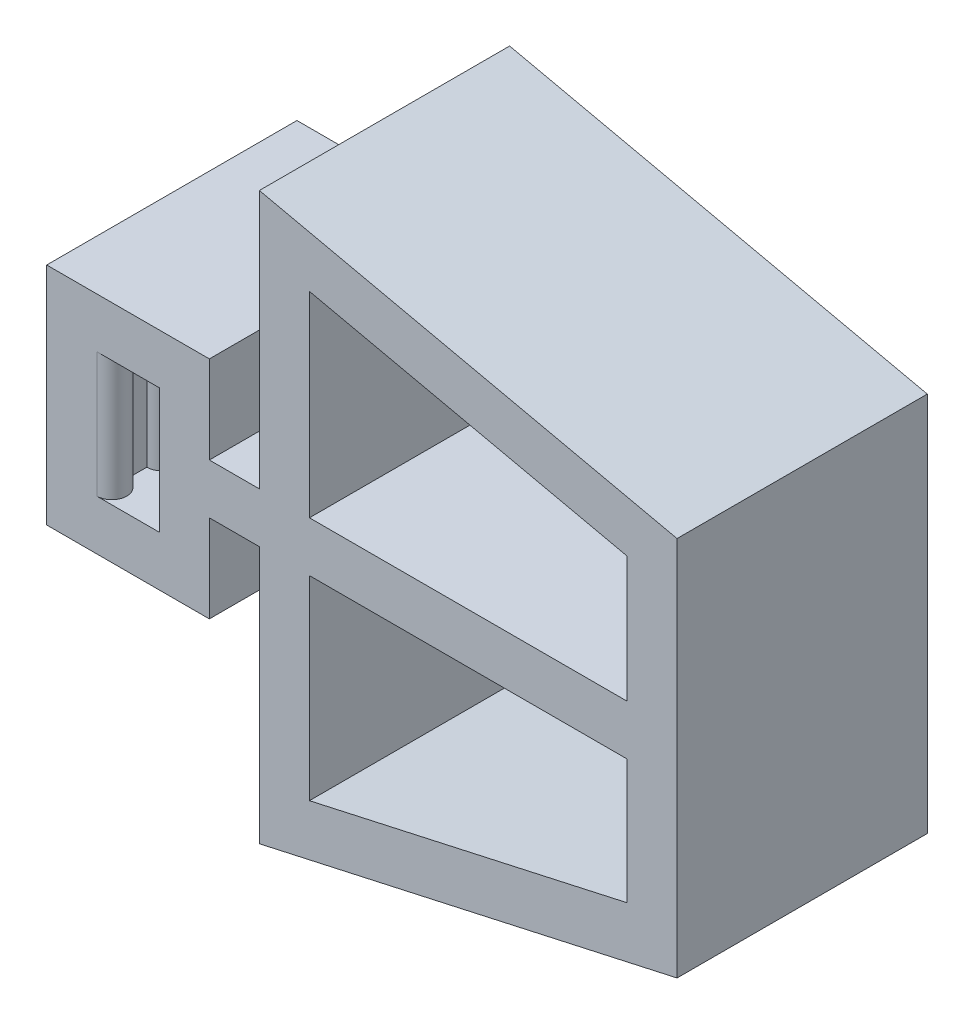
ISO-10303-21;
HEADER;
FILE_DESCRIPTION(('STEP AP214'),'2;1');
FILE_NAME('part.step','',(''),(''),'','','');
FILE_SCHEMA(('AUTOMOTIVE_DESIGN { 1 0 10303 214 1 1 1 1 }'));
ENDSEC;
DATA;
#1=APPLICATION_CONTEXT('core data for automotive mechanical design processes');
#2=APPLICATION_PROTOCOL_DEFINITION('international standard','automotive_design',2000,#1);
#3=PRODUCT_CONTEXT('',#1,'mechanical');
#4=PRODUCT('Part','Part','',(#3));
#5=PRODUCT_RELATED_PRODUCT_CATEGORY('part','',(#4));
#6=PRODUCT_DEFINITION_FORMATION('','',#4);
#7=PRODUCT_DEFINITION_CONTEXT('part definition',#1,'design');
#8=PRODUCT_DEFINITION('design','',#6,#7);
#9=PRODUCT_DEFINITION_SHAPE('','',#8);
#10=(LENGTH_UNIT() NAMED_UNIT(*) SI_UNIT(.MILLI.,.METRE.));
#11=(NAMED_UNIT(*) PLANE_ANGLE_UNIT() SI_UNIT($,.RADIAN.));
#12=(NAMED_UNIT(*) SI_UNIT($,.STERADIAN.) SOLID_ANGLE_UNIT());
#13=UNCERTAINTY_MEASURE_WITH_UNIT(LENGTH_MEASURE(1.E-05),#10,'distance_accuracy_value','');
#14=(GEOMETRIC_REPRESENTATION_CONTEXT(3) GLOBAL_UNCERTAINTY_ASSIGNED_CONTEXT((#13)) GLOBAL_UNIT_ASSIGNED_CONTEXT((#10,
#11,#12)) REPRESENTATION_CONTEXT('',''));
#15=CARTESIAN_POINT('',(0.,0.,0.));
#16=DIRECTION('',(0.,0.,1.));
#17=DIRECTION('',(1.,0.,0.));
#18=AXIS2_PLACEMENT_3D('',#15,#16,#17);
#19=CARTESIAN_POINT('',(0.,-38.3564883880665,10.));
#20=DIRECTION('',(0.,1.,0.));
#21=DIRECTION('',(0.,0.,1.));
#22=AXIS2_PLACEMENT_3D('',#19,#20,#21);
#23=PLANE('',#22);
#24=CARTESIAN_POINT('',(43.3058128637581,-38.3564883880665,1.4));
#25=DIRECTION('',(0.,-1.,0.));
#26=DIRECTION('',(0.,0.,1.));
#27=AXIS2_PLACEMENT_3D('',#24,#25,#26);
#28=CIRCLE('',#27,0.6);
#29=CARTESIAN_POINT('',(43.3058128637581,-38.3564883880665,0.8));
#30=VERTEX_POINT('',#29);
#31=CARTESIAN_POINT('',(43.3058128637581,-38.3564883880665,2.));
#32=VERTEX_POINT('',#31);
#33=EDGE_CURVE('E52',#30,#32,#28,.T.);
#34=ORIENTED_EDGE('',*,*,#33,.F.);
#35=DIRECTION('',(0.,0.,-1.));
#36=VECTOR('',#35,1.);
#37=CARTESIAN_POINT('',(43.3058128637581,-38.3564883880665,10.));
#38=LINE('',#37,#36);
#39=CARTESIAN_POINT('',(43.3058128637581,-38.3564883880665,0.));
#40=VERTEX_POINT('',#39);
#41=EDGE_CURVE('E322',#30,#40,#38,.T.);
#42=ORIENTED_EDGE('',*,*,#41,.T.);
#43=DIRECTION('',(1.,0.,0.));
#44=VECTOR('',#43,1.);
#45=CARTESIAN_POINT('',(0.,-38.3564883880665,0.));
#46=LINE('',#45,#44);
#47=CARTESIAN_POINT('',(45.8058128637581,-38.3564883880665,0.));
#48=VERTEX_POINT('',#47);
#49=EDGE_CURVE('E386',#40,#48,#46,.T.);
#50=ORIENTED_EDGE('',*,*,#49,.T.);
#51=DIRECTION('',(0.,0.,-1.));
#52=VECTOR('',#51,1.);
#53=CARTESIAN_POINT('',(45.8058128637581,-38.3564883880665,10.));
#54=LINE('',#53,#52);
#55=CARTESIAN_POINT('',(45.8058128637581,-38.3564883880665,10.));
#56=VERTEX_POINT('',#55);
#57=EDGE_CURVE('E282',#56,#48,#54,.T.);
#58=ORIENTED_EDGE('',*,*,#57,.F.);
#59=DIRECTION('',(1.,0.,0.));
#60=VECTOR('',#59,1.);
#61=CARTESIAN_POINT('',(0.,-38.3564883880665,10.));
#62=LINE('',#61,#60);
#63=CARTESIAN_POINT('',(43.3058128637581,-38.3564883880665,10.));
#64=VERTEX_POINT('',#63);
#65=EDGE_CURVE('E446',#64,#56,#62,.T.);
#66=ORIENTED_EDGE('',*,*,#65,.F.);
#67=CARTESIAN_POINT('',(43.3058128637581,-38.3564883880665,9.4));
#68=DIRECTION('',(0.,-1.,0.));
#69=DIRECTION('',(0.,0.,1.));
#70=AXIS2_PLACEMENT_3D('',#67,#68,#69);
#71=CIRCLE('',#70,0.6);
#72=CARTESIAN_POINT('',(43.3058128637581,-38.3564883880665,8.8));
#73=VERTEX_POINT('',#72);
#74=EDGE_CURVE('E596',#73,#64,#71,.T.);
#75=ORIENTED_EDGE('',*,*,#74,.F.);
#76=CARTESIAN_POINT('',(43.3058128637581,-38.3564883880665,8.));
#77=VERTEX_POINT('',#76);
#78=EDGE_CURVE('E275',#73,#77,#38,.T.);
#79=ORIENTED_EDGE('',*,*,#78,.T.);
#80=CARTESIAN_POINT('',(43.3058128637581,-38.3564883880665,7.4));
#81=DIRECTION('',(0.,-1.,0.));
#82=DIRECTION('',(0.,0.,1.));
#83=AXIS2_PLACEMENT_3D('',#80,#81,#82);
#84=CIRCLE('',#83,0.6);
#85=CARTESIAN_POINT('',(43.3058128637581,-38.3564883880665,6.8));
#86=VERTEX_POINT('',#85);
#87=EDGE_CURVE('E603',#86,#77,#84,.T.);
#88=ORIENTED_EDGE('',*,*,#87,.F.);
#89=CARTESIAN_POINT('',(43.3058128637581,-38.3564883880665,6.));
#90=VERTEX_POINT('',#89);
#91=EDGE_CURVE('E627',#86,#90,#38,.T.);
#92=ORIENTED_EDGE('',*,*,#91,.T.);
#93=CARTESIAN_POINT('',(43.3058128637581,-38.3564883880665,5.4));
#94=DIRECTION('',(0.,-1.,0.));
#95=DIRECTION('',(0.,0.,1.));
#96=AXIS2_PLACEMENT_3D('',#93,#94,#95);
#97=CIRCLE('',#96,0.6);
#98=CARTESIAN_POINT('',(43.3058128637581,-38.3564883880665,4.8));
#99=VERTEX_POINT('',#98);
#100=EDGE_CURVE('E612',#99,#90,#97,.T.);
#101=ORIENTED_EDGE('',*,*,#100,.F.);
#102=CARTESIAN_POINT('',(43.3058128637581,-38.3564883880665,4.));
#103=VERTEX_POINT('',#102);
#104=EDGE_CURVE('E626',#99,#103,#38,.T.);
#105=ORIENTED_EDGE('',*,*,#104,.T.);
#106=CARTESIAN_POINT('',(43.3058128637581,-38.3564883880665,3.4));
#107=DIRECTION('',(0.,-1.,0.));
#108=DIRECTION('',(0.,0.,1.));
#109=AXIS2_PLACEMENT_3D('',#106,#107,#108);
#110=CIRCLE('',#109,0.6);
#111=CARTESIAN_POINT('',(43.3058128637581,-38.3564883880665,2.8));
#112=VERTEX_POINT('',#111);
#113=EDGE_CURVE('E60',#112,#103,#110,.T.);
#114=ORIENTED_EDGE('',*,*,#113,.F.);
#115=EDGE_CURVE('E624',#112,#32,#38,.T.);
#116=ORIENTED_EDGE('',*,*,#115,.T.);
#117=EDGE_LOOP('',(#34,#42,#50,#58,#66,#75,#79,#88,#92,#101,#105,#114,#116));
#118=FACE_BOUND('',#117,.T.);
#119=ADVANCED_FACE('F35',(#118),#23,.F.);
#120=CARTESIAN_POINT('',(0.,-43.3564883880665,10.));
#121=DIRECTION('',(0.,1.,0.));
#122=DIRECTION('',(0.,0.,1.));
#123=AXIS2_PLACEMENT_3D('',#120,#121,#122);
#124=PLANE('',#123);
#125=DIRECTION('',(0.,0.,-1.));
#126=VECTOR('',#125,1.);
#127=CARTESIAN_POINT('',(43.3058128637581,-43.3564883880665,10.));
#128=LINE('',#127,#126);
#129=CARTESIAN_POINT('',(43.3058128637581,-43.3564883880665,0.8));
#130=VERTEX_POINT('',#129);
#131=CARTESIAN_POINT('',(43.3058128637581,-43.3564883880665,0.));
#132=VERTEX_POINT('',#131);
#133=EDGE_CURVE('E266',#130,#132,#128,.T.);
#134=ORIENTED_EDGE('',*,*,#133,.F.);
#135=CARTESIAN_POINT('',(43.3058128637581,-43.3564883880665,1.4));
#136=DIRECTION('',(0.,-1.,0.));
#137=DIRECTION('',(0.,0.,1.));
#138=AXIS2_PLACEMENT_3D('',#135,#136,#137);
#139=CIRCLE('',#138,0.6);
#140=CARTESIAN_POINT('',(43.3058128637581,-43.3564883880665,2.));
#141=VERTEX_POINT('',#140);
#142=EDGE_CURVE('E251',#130,#141,#139,.T.);
#143=ORIENTED_EDGE('',*,*,#142,.T.);
#144=CARTESIAN_POINT('',(43.3058128637581,-43.3564883880665,2.8));
#145=VERTEX_POINT('',#144);
#146=EDGE_CURVE('E264',#145,#141,#128,.T.);
#147=ORIENTED_EDGE('',*,*,#146,.F.);
#148=CARTESIAN_POINT('',(43.3058128637581,-43.3564883880665,3.4));
#149=DIRECTION('',(0.,-1.,0.));
#150=DIRECTION('',(0.,0.,1.));
#151=AXIS2_PLACEMENT_3D('',#148,#149,#150);
#152=CIRCLE('',#151,0.6);
#153=CARTESIAN_POINT('',(43.3058128637581,-43.3564883880665,4.));
#154=VERTEX_POINT('',#153);
#155=EDGE_CURVE('E619',#145,#154,#152,.T.);
#156=ORIENTED_EDGE('',*,*,#155,.T.);
#157=CARTESIAN_POINT('',(43.3058128637581,-43.3564883880665,4.8));
#158=VERTEX_POINT('',#157);
#159=EDGE_CURVE('E271',#158,#154,#128,.T.);
#160=ORIENTED_EDGE('',*,*,#159,.F.);
#161=CARTESIAN_POINT('',(43.3058128637581,-43.3564883880665,5.4));
#162=DIRECTION('',(0.,-1.,0.));
#163=DIRECTION('',(0.,0.,1.));
#164=AXIS2_PLACEMENT_3D('',#161,#162,#163);
#165=CIRCLE('',#164,0.6);
#166=CARTESIAN_POINT('',(43.3058128637581,-43.3564883880665,6.));
#167=VERTEX_POINT('',#166);
#168=EDGE_CURVE('E611',#158,#167,#165,.T.);
#169=ORIENTED_EDGE('',*,*,#168,.T.);
#170=CARTESIAN_POINT('',(43.3058128637581,-43.3564883880665,6.8));
#171=VERTEX_POINT('',#170);
#172=EDGE_CURVE('E274',#171,#167,#128,.T.);
#173=ORIENTED_EDGE('',*,*,#172,.F.);
#174=CARTESIAN_POINT('',(43.3058128637581,-43.3564883880665,7.4));
#175=DIRECTION('',(0.,-1.,0.));
#176=DIRECTION('',(0.,0.,1.));
#177=AXIS2_PLACEMENT_3D('',#174,#175,#176);
#178=CIRCLE('',#177,0.6);
#179=CARTESIAN_POINT('',(43.3058128637581,-43.3564883880665,8.));
#180=VERTEX_POINT('',#179);
#181=EDGE_CURVE('E592',#171,#180,#178,.T.);
#182=ORIENTED_EDGE('',*,*,#181,.T.);
#183=CARTESIAN_POINT('',(43.3058128637581,-43.3564883880665,8.8));
#184=VERTEX_POINT('',#183);
#185=EDGE_CURVE('E276',#184,#180,#128,.T.);
#186=ORIENTED_EDGE('',*,*,#185,.F.);
#187=CARTESIAN_POINT('',(43.3058128637581,-43.3564883880665,9.4));
#188=DIRECTION('',(0.,-1.,0.));
#189=DIRECTION('',(0.,0.,1.));
#190=AXIS2_PLACEMENT_3D('',#187,#188,#189);
#191=CIRCLE('',#190,0.6);
#192=CARTESIAN_POINT('',(43.3058128637581,-43.3564883880665,10.));
#193=VERTEX_POINT('',#192);
#194=EDGE_CURVE('E590',#184,#193,#191,.T.);
#195=ORIENTED_EDGE('',*,*,#194,.T.);
#196=DIRECTION('',(1.,0.,0.));
#197=VECTOR('',#196,1.);
#198=CARTESIAN_POINT('',(0.,-43.3564883880665,10.));
#199=LINE('',#198,#197);
#200=CARTESIAN_POINT('',(45.8058128637581,-43.3564883880665,10.));
#201=VERTEX_POINT('',#200);
#202=EDGE_CURVE('E439',#193,#201,#199,.T.);
#203=ORIENTED_EDGE('',*,*,#202,.T.);
#204=DIRECTION('',(0.,0.,-1.));
#205=VECTOR('',#204,1.);
#206=CARTESIAN_POINT('',(45.8058128637581,-43.3564883880665,10.));
#207=LINE('',#206,#205);
#208=CARTESIAN_POINT('',(45.8058128637581,-43.3564883880665,0.));
#209=VERTEX_POINT('',#208);
#210=EDGE_CURVE('E280',#201,#209,#207,.T.);
#211=ORIENTED_EDGE('',*,*,#210,.T.);
#212=DIRECTION('',(1.,0.,0.));
#213=VECTOR('',#212,1.);
#214=CARTESIAN_POINT('',(0.,-43.3564883880665,0.));
#215=LINE('',#214,#213);
#216=EDGE_CURVE('E392',#132,#209,#215,.T.);
#217=ORIENTED_EDGE('',*,*,#216,.F.);
#218=EDGE_LOOP('',(#134,#143,#147,#156,#160,#169,#173,#182,#186,#195,#203,#211,#217));
#219=FACE_BOUND('',#218,.T.);
#220=ADVANCED_FACE('F262',(#219),#124,.T.);
#221=CARTESIAN_POINT('',(43.3058128637581,0.,10.));
#222=DIRECTION('',(1.,0.,0.));
#223=DIRECTION('',(0.,0.,-1.));
#224=AXIS2_PLACEMENT_3D('',#221,#222,#223);
#225=PLANE('',#224);
#226=ORIENTED_EDGE('',*,*,#41,.F.);
#227=DIRECTION('',(0.,1.,0.));
#228=VECTOR('',#227,1.);
#229=CARTESIAN_POINT('',(43.3058128637581,-43.3564883880665,0.8));
#230=LINE('',#229,#228);
#231=EDGE_CURVE('E257',#130,#30,#230,.T.);
#232=ORIENTED_EDGE('',*,*,#231,.F.);
#233=ORIENTED_EDGE('',*,*,#133,.T.);
#234=DIRECTION('',(0.,-1.,0.));
#235=VECTOR('',#234,1.);
#236=CARTESIAN_POINT('',(43.3058128637581,0.,0.));
#237=LINE('',#236,#235);
#238=EDGE_CURVE('E395',#40,#132,#237,.T.);
#239=ORIENTED_EDGE('',*,*,#238,.F.);
#240=EDGE_LOOP('',(#226,#232,#233,#239));
#241=FACE_BOUND('',#240,.T.);
#242=ADVANCED_FACE('F501',(#241),#225,.T.);
#243=ORIENTED_EDGE('',*,*,#146,.T.);
#244=DIRECTION('',(0.,1.,0.));
#245=VECTOR('',#244,1.);
#246=CARTESIAN_POINT('',(43.3058128637581,-43.3564883880665,2.));
#247=LINE('',#246,#245);
#248=EDGE_CURVE('E248',#141,#32,#247,.T.);
#249=ORIENTED_EDGE('',*,*,#248,.T.);
#250=ORIENTED_EDGE('',*,*,#115,.F.);
#251=DIRECTION('',(0.,1.,0.));
#252=VECTOR('',#251,1.);
#253=CARTESIAN_POINT('',(43.3058128637581,-43.3564883880665,2.8));
#254=LINE('',#253,#252);
#255=EDGE_CURVE('E270',#145,#112,#254,.T.);
#256=ORIENTED_EDGE('',*,*,#255,.F.);
#257=EDGE_LOOP('',(#243,#249,#250,#256));
#258=FACE_BOUND('',#257,.T.);
#259=ADVANCED_FACE('F269',(#258),#225,.T.);
#260=ORIENTED_EDGE('',*,*,#159,.T.);
#261=DIRECTION('',(0.,1.,0.));
#262=VECTOR('',#261,1.);
#263=CARTESIAN_POINT('',(43.3058128637581,-43.3564883880665,4.));
#264=LINE('',#263,#262);
#265=EDGE_CURVE('E614',#154,#103,#264,.T.);
#266=ORIENTED_EDGE('',*,*,#265,.T.);
#267=ORIENTED_EDGE('',*,*,#104,.F.);
#268=DIRECTION('',(0.,1.,0.));
#269=VECTOR('',#268,1.);
#270=CARTESIAN_POINT('',(43.3058128637581,-43.3564883880665,4.8));
#271=LINE('',#270,#269);
#272=EDGE_CURVE('E609',#158,#99,#271,.T.);
#273=ORIENTED_EDGE('',*,*,#272,.F.);
#274=EDGE_LOOP('',(#260,#266,#267,#273));
#275=FACE_BOUND('',#274,.T.);
#276=ADVANCED_FACE('F572',(#275),#225,.T.);
#277=ORIENTED_EDGE('',*,*,#172,.T.);
#278=DIRECTION('',(0.,1.,0.));
#279=VECTOR('',#278,1.);
#280=CARTESIAN_POINT('',(43.3058128637581,-43.3564883880665,6.));
#281=LINE('',#280,#279);
#282=EDGE_CURVE('E605',#167,#90,#281,.T.);
#283=ORIENTED_EDGE('',*,*,#282,.T.);
#284=ORIENTED_EDGE('',*,*,#91,.F.);
#285=DIRECTION('',(0.,1.,0.));
#286=VECTOR('',#285,1.);
#287=CARTESIAN_POINT('',(43.3058128637581,-43.3564883880665,6.8));
#288=LINE('',#287,#286);
#289=EDGE_CURVE('E601',#171,#86,#288,.T.);
#290=ORIENTED_EDGE('',*,*,#289,.F.);
#291=EDGE_LOOP('',(#277,#283,#284,#290));
#292=FACE_BOUND('',#291,.T.);
#293=ADVANCED_FACE('F575',(#292),#225,.T.);
#294=ORIENTED_EDGE('',*,*,#185,.T.);
#295=DIRECTION('',(0.,1.,0.));
#296=VECTOR('',#295,1.);
#297=CARTESIAN_POINT('',(43.3058128637581,-43.3564883880665,8.));
#298=LINE('',#297,#296);
#299=EDGE_CURVE('E584',#180,#77,#298,.T.);
#300=ORIENTED_EDGE('',*,*,#299,.T.);
#301=ORIENTED_EDGE('',*,*,#78,.F.);
#302=DIRECTION('',(0.,1.,0.));
#303=VECTOR('',#302,1.);
#304=CARTESIAN_POINT('',(43.3058128637581,-43.3564883880665,8.8));
#305=LINE('',#304,#303);
#306=EDGE_CURVE('E349',#184,#73,#305,.T.);
#307=ORIENTED_EDGE('',*,*,#306,.F.);
#308=EDGE_LOOP('',(#294,#300,#301,#307));
#309=FACE_BOUND('',#308,.T.);
#310=ADVANCED_FACE('F566',(#309),#225,.T.);
#311=CARTESIAN_POINT('',(0.,-41.8564883880665,10.));
#312=DIRECTION('',(0.,-1.,0.));
#313=DIRECTION('',(1.,0.,0.));
#314=AXIS2_PLACEMENT_3D('',#311,#312,#313);
#315=PLANE('',#314);
#316=DIRECTION('',(-1.,0.,0.));
#317=VECTOR('',#316,1.);
#318=CARTESIAN_POINT('',(0.,-41.8564883880665,0.));
#319=LINE('',#318,#317);
#320=CARTESIAN_POINT('',(64.4976609563172,-41.8564883880665,0.));
#321=VERTEX_POINT('',#320);
#322=CARTESIAN_POINT('',(51.8058128637581,-41.8564883880665,0.));
#323=VERTEX_POINT('',#322);
#324=EDGE_CURVE('E398',#321,#323,#319,.T.);
#325=ORIENTED_EDGE('',*,*,#324,.F.);
#326=DIRECTION('',(0.,0.,-1.));
#327=VECTOR('',#326,1.);
#328=CARTESIAN_POINT('',(64.4976609563172,-41.8564883880665,10.));
#329=LINE('',#328,#327);
#330=CARTESIAN_POINT('',(64.4976609563172,-41.8564883880665,10.));
#331=VERTEX_POINT('',#330);
#332=EDGE_CURVE('E11',#331,#321,#329,.T.);
#333=ORIENTED_EDGE('',*,*,#332,.F.);
#334=DIRECTION('',(-1.,0.,0.));
#335=VECTOR('',#334,1.);
#336=CARTESIAN_POINT('',(0.,-41.8564883880665,10.));
#337=LINE('',#336,#335);
#338=CARTESIAN_POINT('',(51.8058128637581,-41.8564883880665,10.));
#339=VERTEX_POINT('',#338);
#340=EDGE_CURVE('E431',#331,#339,#337,.T.);
#341=ORIENTED_EDGE('',*,*,#340,.T.);
#342=DIRECTION('',(0.,0.,-1.));
#343=VECTOR('',#342,1.);
#344=CARTESIAN_POINT('',(51.8058128637581,-41.8564883880665,10.));
#345=LINE('',#344,#343);
#346=EDGE_CURVE('E285',#339,#323,#345,.T.);
#347=ORIENTED_EDGE('',*,*,#346,.T.);
#348=EDGE_LOOP('',(#325,#333,#341,#347));
#349=FACE_BOUND('',#348,.T.);
#350=ADVANCED_FACE('F563',(#349),#315,.T.);
#351=CARTESIAN_POINT('',(64.4976609563172,0.,10.));
#352=DIRECTION('',(-1.,0.,0.));
#353=DIRECTION('',(0.,0.,1.));
#354=AXIS2_PLACEMENT_3D('',#351,#352,#353);
#355=PLANE('',#354);
#356=DIRECTION('',(0.,1.,0.));
#357=VECTOR('',#356,1.);
#358=CARTESIAN_POINT('',(64.4976609563172,0.,0.));
#359=LINE('',#358,#357);
#360=CARTESIAN_POINT('',(64.4976609563172,-46.8330535692618,0.));
#361=VERTEX_POINT('',#360);
#362=EDGE_CURVE('E351',#361,#321,#359,.T.);
#363=ORIENTED_EDGE('',*,*,#362,.F.);
#364=DIRECTION('',(0.,0.,-1.));
#365=VECTOR('',#364,1.);
#366=CARTESIAN_POINT('',(64.4976609563172,-46.8330535692618,10.));
#367=LINE('',#366,#365);
#368=CARTESIAN_POINT('',(64.4976609563172,-46.8330535692618,10.));
#369=VERTEX_POINT('',#368);
#370=EDGE_CURVE('E44',#369,#361,#367,.T.);
#371=ORIENTED_EDGE('',*,*,#370,.F.);
#372=DIRECTION('',(0.,1.,0.));
#373=VECTOR('',#372,1.);
#374=CARTESIAN_POINT('',(64.4976609563172,0.,10.));
#375=LINE('',#374,#373);
#376=EDGE_CURVE('E426',#369,#331,#375,.T.);
#377=ORIENTED_EDGE('',*,*,#376,.T.);
#378=ORIENTED_EDGE('',*,*,#332,.T.);
#379=EDGE_LOOP('',(#363,#371,#377,#378));
#380=FACE_BOUND('',#379,.T.);
#381=ADVANCED_FACE('F419',(#380),#355,.T.);
#382=CARTESIAN_POINT('',(12.9177161387051,-58.2680520347448,10.));
#383=DIRECTION('',(-0.216439613938121,0.976296007119929,0.));
#384=DIRECTION('',(-0.976296007119929,-0.216439613938121,0.));
#385=AXIS2_PLACEMENT_3D('',#382,#383,#384);
#386=PLANE('',#385);
#387=DIRECTION('',(0.976296007119929,0.216439613938121,0.));
#388=VECTOR('',#387,1.);
#389=CARTESIAN_POINT('',(12.9177161387051,-58.2680520347448,0.));
#390=LINE('',#389,#388);
#391=CARTESIAN_POINT('',(51.8058128637581,-49.6467685504574,0.));
#392=VERTEX_POINT('',#391);
#393=EDGE_CURVE('E401',#392,#361,#390,.T.);
#394=ORIENTED_EDGE('',*,*,#393,.F.);
#395=DIRECTION('',(0.,0.,-1.));
#396=VECTOR('',#395,1.);
#397=CARTESIAN_POINT('',(51.8058128637581,-49.6467685504574,10.));
#398=LINE('',#397,#396);
#399=CARTESIAN_POINT('',(51.8058128637581,-49.6467685504574,10.));
#400=VERTEX_POINT('',#399);
#401=EDGE_CURVE('E405',#400,#392,#398,.T.);
#402=ORIENTED_EDGE('',*,*,#401,.F.);
#403=DIRECTION('',(0.976296007119929,0.216439613938121,0.));
#404=VECTOR('',#403,1.);
#405=CARTESIAN_POINT('',(12.9177161387051,-58.2680520347448,10.));
#406=LINE('',#405,#404);
#407=EDGE_CURVE('E414',#400,#369,#406,.T.);
#408=ORIENTED_EDGE('',*,*,#407,.T.);
#409=ORIENTED_EDGE('',*,*,#370,.T.);
#410=EDGE_LOOP('',(#394,#402,#408,#409));
#411=FACE_BOUND('',#410,.T.);
#412=ADVANCED_FACE('F411',(#411),#386,.T.);
#413=CARTESIAN_POINT('',(45.8058128637581,0.,10.));
#414=DIRECTION('',(1.,0.,0.));
#415=DIRECTION('',(0.,0.,-1.));
#416=AXIS2_PLACEMENT_3D('',#413,#414,#415);
#417=PLANE('',#416);
#418=DIRECTION('',(0.,-1.,0.));
#419=VECTOR('',#418,1.);
#420=CARTESIAN_POINT('',(45.8058128637581,0.,0.));
#421=LINE('',#420,#419);
#422=EDGE_CURVE('E389',#48,#209,#421,.T.);
#423=ORIENTED_EDGE('',*,*,#422,.T.);
#424=ORIENTED_EDGE('',*,*,#210,.F.);
#425=DIRECTION('',(0.,-1.,0.));
#426=VECTOR('',#425,1.);
#427=CARTESIAN_POINT('',(45.8058128637581,0.,10.));
#428=LINE('',#427,#426);
#429=EDGE_CURVE('E444',#56,#201,#428,.T.);
#430=ORIENTED_EDGE('',*,*,#429,.F.);
#431=ORIENTED_EDGE('',*,*,#57,.T.);
#432=EDGE_LOOP('',(#423,#424,#430,#431));
#433=FACE_BOUND('',#432,.T.);
#434=ADVANCED_FACE('F505',(#433),#417,.F.);
#435=CARTESIAN_POINT('',(47.805812863758,0.,10.));
#436=DIRECTION('',(-1.,0.,0.));
#437=DIRECTION('',(0.,0.,1.));
#438=AXIS2_PLACEMENT_3D('',#435,#436,#437);
#439=PLANE('',#438);
#440=DIRECTION('',(0.,1.,0.));
#441=VECTOR('',#440,1.);
#442=CARTESIAN_POINT('',(47.805812863758,0.,0.));
#443=LINE('',#442,#441);
#444=CARTESIAN_POINT('',(47.805812863758,-45.3564883880665,0.));
#445=VERTEX_POINT('',#444);
#446=CARTESIAN_POINT('',(47.805812863758,-41.8564883880665,0.));
#447=VERTEX_POINT('',#446);
#448=EDGE_CURVE('E362',#445,#447,#443,.T.);
#449=ORIENTED_EDGE('',*,*,#448,.T.);
#450=DIRECTION('',(0.,0.,-1.));
#451=VECTOR('',#450,1.);
#452=CARTESIAN_POINT('',(47.805812863758,-41.8564883880665,10.));
#453=LINE('',#452,#451);
#454=CARTESIAN_POINT('',(47.805812863758,-41.8564883880665,10.));
#455=VERTEX_POINT('',#454);
#456=EDGE_CURVE('E319',#455,#447,#453,.T.);
#457=ORIENTED_EDGE('',*,*,#456,.F.);
#458=DIRECTION('',(0.,1.,0.));
#459=VECTOR('',#458,1.);
#460=CARTESIAN_POINT('',(47.805812863758,0.,10.));
#461=LINE('',#460,#459);
#462=CARTESIAN_POINT('',(47.805812863758,-45.3564883880665,10.));
#463=VERTEX_POINT('',#462);
#464=EDGE_CURVE('E470',#463,#455,#461,.T.);
#465=ORIENTED_EDGE('',*,*,#464,.F.);
#466=DIRECTION('',(0.,0.,-1.));
#467=VECTOR('',#466,1.);
#468=CARTESIAN_POINT('',(47.805812863758,-45.3564883880665,10.));
#469=LINE('',#468,#467);
#470=EDGE_CURVE('E286',#463,#445,#469,.T.);
#471=ORIENTED_EDGE('',*,*,#470,.T.);
#472=EDGE_LOOP('',(#449,#457,#465,#471));
#473=FACE_BOUND('',#472,.T.);
#474=ADVANCED_FACE('F546',(#473),#439,.F.);
#475=CARTESIAN_POINT('',(0.,-41.8564883880665,10.));
#476=DIRECTION('',(0.,1.,0.));
#477=DIRECTION('',(0.,0.,1.));
#478=AXIS2_PLACEMENT_3D('',#475,#476,#477);
#479=PLANE('',#478);
#480=DIRECTION('',(1.,0.,0.));
#481=VECTOR('',#480,1.);
#482=CARTESIAN_POINT('',(0.,-41.8564883880665,0.));
#483=LINE('',#482,#481);
#484=CARTESIAN_POINT('',(49.8058128637581,-41.8564883880665,0.));
#485=VERTEX_POINT('',#484);
#486=EDGE_CURVE('E365',#447,#485,#483,.T.);
#487=ORIENTED_EDGE('',*,*,#486,.T.);
#488=DIRECTION('',(0.,0.,-1.));
#489=VECTOR('',#488,1.);
#490=CARTESIAN_POINT('',(49.8058128637581,-41.8564883880665,10.));
#491=LINE('',#490,#489);
#492=CARTESIAN_POINT('',(49.8058128637581,-41.8564883880665,10.));
#493=VERTEX_POINT('',#492);
#494=EDGE_CURVE('E316',#493,#485,#491,.T.);
#495=ORIENTED_EDGE('',*,*,#494,.F.);
#496=DIRECTION('',(1.,0.,0.));
#497=VECTOR('',#496,1.);
#498=CARTESIAN_POINT('',(0.,-41.8564883880665,10.));
#499=LINE('',#498,#497);
#500=EDGE_CURVE('E468',#455,#493,#499,.T.);
#501=ORIENTED_EDGE('',*,*,#500,.F.);
#502=ORIENTED_EDGE('',*,*,#456,.T.);
#503=EDGE_LOOP('',(#487,#495,#501,#502));
#504=FACE_BOUND('',#503,.T.);
#505=ADVANCED_FACE('F543',(#504),#479,.F.);
#506=CARTESIAN_POINT('',(49.8058128637581,0.,10.));
#507=DIRECTION('',(1.,0.,0.));
#508=DIRECTION('',(0.,0.,-1.));
#509=AXIS2_PLACEMENT_3D('',#506,#507,#508);
#510=PLANE('',#509);
#511=DIRECTION('',(0.,-1.,0.));
#512=VECTOR('',#511,1.);
#513=CARTESIAN_POINT('',(49.8058128637581,0.,0.));
#514=LINE('',#513,#512);
#515=CARTESIAN_POINT('',(49.8058128637581,-52.1387169043723,0.));
#516=VERTEX_POINT('',#515);
#517=EDGE_CURVE('E367',#485,#516,#514,.T.);
#518=ORIENTED_EDGE('',*,*,#517,.T.);
#519=DIRECTION('',(0.,0.,-1.));
#520=VECTOR('',#519,1.);
#521=CARTESIAN_POINT('',(49.8058128637581,-52.1387169043723,10.));
#522=LINE('',#521,#520);
#523=CARTESIAN_POINT('',(49.8058128637581,-52.1387169043723,10.));
#524=VERTEX_POINT('',#523);
#525=EDGE_CURVE('E313',#524,#516,#522,.T.);
#526=ORIENTED_EDGE('',*,*,#525,.F.);
#527=DIRECTION('',(0.,-1.,0.));
#528=VECTOR('',#527,1.);
#529=CARTESIAN_POINT('',(49.8058128637581,0.,10.));
#530=LINE('',#529,#528);
#531=EDGE_CURVE('E466',#493,#524,#530,.T.);
#532=ORIENTED_EDGE('',*,*,#531,.F.);
#533=ORIENTED_EDGE('',*,*,#494,.T.);
#534=EDGE_LOOP('',(#518,#526,#532,#533));
#535=FACE_BOUND('',#534,.T.);
#536=ADVANCED_FACE('F531',(#535),#510,.F.);
#537=CARTESIAN_POINT('',(13.3505953665813,-60.2206440489846,10.));
#538=DIRECTION('',(-0.21643961393812,0.97629600711993,0.));
#539=DIRECTION('',(-0.97629600711993,-0.21643961393812,0.));
#540=AXIS2_PLACEMENT_3D('',#537,#538,#539);
#541=PLANE('',#540);
#542=DIRECTION('',(0.97629600711993,0.21643961393812,0.));
#543=VECTOR('',#542,1.);
#544=CARTESIAN_POINT('',(13.3505953665813,-60.2206440489846,0.));
#545=LINE('',#544,#543);
#546=CARTESIAN_POINT('',(66.4976609563172,-48.4382232726049,0.));
#547=VERTEX_POINT('',#546);
#548=EDGE_CURVE('E369',#516,#547,#545,.T.);
#549=ORIENTED_EDGE('',*,*,#548,.T.);
#550=DIRECTION('',(0.,0.,-1.));
#551=VECTOR('',#550,1.);
#552=CARTESIAN_POINT('',(66.4976609563172,-48.4382232726049,10.));
#553=LINE('',#552,#551);
#554=CARTESIAN_POINT('',(66.4976609563172,-48.4382232726049,10.));
#555=VERTEX_POINT('',#554);
#556=EDGE_CURVE('E310',#555,#547,#553,.T.);
#557=ORIENTED_EDGE('',*,*,#556,.F.);
#558=DIRECTION('',(0.97629600711993,0.21643961393812,0.));
#559=VECTOR('',#558,1.);
#560=CARTESIAN_POINT('',(13.3505953665813,-60.2206440489846,10.));
#561=LINE('',#560,#559);
#562=EDGE_CURVE('E464',#524,#555,#561,.T.);
#563=ORIENTED_EDGE('',*,*,#562,.F.);
#564=ORIENTED_EDGE('',*,*,#525,.T.);
#565=EDGE_LOOP('',(#549,#557,#563,#564));
#566=FACE_BOUND('',#565,.T.);
#567=ADVANCED_FACE('F538',(#566),#541,.F.);
#568=CARTESIAN_POINT('',(66.4976609563172,0.,10.));
#569=DIRECTION('',(-1.,0.,0.));
#570=DIRECTION('',(0.,0.,1.));
#571=AXIS2_PLACEMENT_3D('',#568,#569,#570);
#572=PLANE('',#571);
#573=DIRECTION('',(0.,1.,0.));
#574=VECTOR('',#573,1.);
#575=CARTESIAN_POINT('',(66.4976609563172,0.,0.));
#576=LINE('',#575,#574);
#577=CARTESIAN_POINT('',(66.4976609563172,-33.2278838659186,0.));
#578=VERTEX_POINT('',#577);
#579=EDGE_CURVE('E372',#547,#578,#576,.T.);
#580=ORIENTED_EDGE('',*,*,#579,.T.);
#581=DIRECTION('',(0.,0.,-1.));
#582=VECTOR('',#581,1.);
#583=CARTESIAN_POINT('',(66.4976609563172,-33.2278838659186,10.));
#584=LINE('',#583,#582);
#585=CARTESIAN_POINT('',(66.4976609563172,-33.2278838659186,10.));
#586=VERTEX_POINT('',#585);
#587=EDGE_CURVE('E307',#586,#578,#584,.T.);
#588=ORIENTED_EDGE('',*,*,#587,.F.);
#589=DIRECTION('',(0.,1.,0.));
#590=VECTOR('',#589,1.);
#591=CARTESIAN_POINT('',(66.4976609563172,0.,10.));
#592=LINE('',#591,#590);
#593=EDGE_CURVE('E462',#555,#586,#592,.T.);
#594=ORIENTED_EDGE('',*,*,#593,.F.);
#595=ORIENTED_EDGE('',*,*,#556,.T.);
#596=EDGE_LOOP('',(#580,#588,#594,#595));
#597=FACE_BOUND('',#596,.T.);
#598=ADVANCED_FACE('F534',(#597),#572,.F.);
#599=CARTESIAN_POINT('',(-3.90619875442622,-17.6197239385846,10.));
#600=DIRECTION('',(-0.216439613938102,-0.976296007119934,0.));
#601=DIRECTION('',(0.976296007119934,-0.216439613938102,0.));
#602=AXIS2_PLACEMENT_3D('',#599,#600,#601);
#603=PLANE('',#602);
#604=DIRECTION('',(-0.976296007119934,0.216439613938102,0.));
#605=VECTOR('',#604,1.);
#606=CARTESIAN_POINT('',(-3.90619875442622,-17.6197239385846,0.));
#607=LINE('',#606,#605);
#608=CARTESIAN_POINT('',(49.8058128637581,-29.5273902341516,0.));
#609=VERTEX_POINT('',#608);
#610=EDGE_CURVE('E374',#578,#609,#607,.T.);
#611=ORIENTED_EDGE('',*,*,#610,.T.);
#612=DIRECTION('',(0.,0.,-1.));
#613=VECTOR('',#612,1.);
#614=CARTESIAN_POINT('',(49.8058128637581,-29.5273902341516,10.));
#615=LINE('',#614,#613);
#616=CARTESIAN_POINT('',(49.8058128637581,-29.5273902341516,10.));
#617=VERTEX_POINT('',#616);
#618=EDGE_CURVE('E304',#617,#609,#615,.T.);
#619=ORIENTED_EDGE('',*,*,#618,.F.);
#620=DIRECTION('',(-0.976296007119934,0.216439613938102,0.));
#621=VECTOR('',#620,1.);
#622=CARTESIAN_POINT('',(-3.90619875442622,-17.6197239385846,10.));
#623=LINE('',#622,#621);
#624=EDGE_CURVE('E460',#586,#617,#623,.T.);
#625=ORIENTED_EDGE('',*,*,#624,.F.);
#626=ORIENTED_EDGE('',*,*,#587,.T.);
#627=EDGE_LOOP('',(#611,#619,#625,#626));
#628=FACE_BOUND('',#627,.T.);
#629=ADVANCED_FACE('F529',(#628),#603,.F.);
#630=CARTESIAN_POINT('',(49.8058128637581,-39.8564883880665,0.));
#631=VERTEX_POINT('',#630);
#632=EDGE_CURVE('E370',#609,#631,#514,.T.);
#633=ORIENTED_EDGE('',*,*,#632,.T.);
#634=DIRECTION('',(0.,0.,-1.));
#635=VECTOR('',#634,1.);
#636=CARTESIAN_POINT('',(49.8058128637581,-39.8564883880665,10.));
#637=LINE('',#636,#635);
#638=CARTESIAN_POINT('',(49.8058128637581,-39.8564883880665,10.));
#639=VERTEX_POINT('',#638);
#640=EDGE_CURVE('E301',#639,#631,#637,.T.);
#641=ORIENTED_EDGE('',*,*,#640,.F.);
#642=EDGE_CURVE('E459',#617,#639,#530,.T.);
#643=ORIENTED_EDGE('',*,*,#642,.F.);
#644=ORIENTED_EDGE('',*,*,#618,.T.);
#645=EDGE_LOOP('',(#633,#641,#643,#644));
#646=FACE_BOUND('',#645,.T.);
#647=ADVANCED_FACE('F525',(#646),#510,.F.);
#648=CARTESIAN_POINT('',(0.,-39.8564883880665,10.));
#649=DIRECTION('',(0.,-1.,0.));
#650=DIRECTION('',(0.,0.,-1.));
#651=AXIS2_PLACEMENT_3D('',#648,#649,#650);
#652=PLANE('',#651);
#653=DIRECTION('',(-1.,0.,0.));
#654=VECTOR('',#653,1.);
#655=CARTESIAN_POINT('',(0.,-39.8564883880665,0.));
#656=LINE('',#655,#654);
#657=CARTESIAN_POINT('',(47.8058128637581,-39.8564883880665,0.));
#658=VERTEX_POINT('',#657);
#659=EDGE_CURVE('E376',#631,#658,#656,.T.);
#660=ORIENTED_EDGE('',*,*,#659,.T.);
#661=DIRECTION('',(0.,0.,-1.));
#662=VECTOR('',#661,1.);
#663=CARTESIAN_POINT('',(47.8058128637581,-39.8564883880665,10.));
#664=LINE('',#663,#662);
#665=CARTESIAN_POINT('',(47.8058128637581,-39.8564883880665,10.));
#666=VERTEX_POINT('',#665);
#667=EDGE_CURVE('E298',#666,#658,#664,.T.);
#668=ORIENTED_EDGE('',*,*,#667,.F.);
#669=DIRECTION('',(-1.,0.,0.));
#670=VECTOR('',#669,1.);
#671=CARTESIAN_POINT('',(0.,-39.8564883880665,10.));
#672=LINE('',#671,#670);
#673=EDGE_CURVE('E457',#639,#666,#672,.T.);
#674=ORIENTED_EDGE('',*,*,#673,.F.);
#675=ORIENTED_EDGE('',*,*,#640,.T.);
#676=EDGE_LOOP('',(#660,#668,#674,#675));
#677=FACE_BOUND('',#676,.T.);
#678=ADVANCED_FACE('F521',(#677),#652,.F.);
#679=CARTESIAN_POINT('',(47.8058128637581,0.,10.));
#680=DIRECTION('',(-1.,0.,0.));
#681=DIRECTION('',(0.,0.,1.));
#682=AXIS2_PLACEMENT_3D('',#679,#680,#681);
#683=PLANE('',#682);
#684=DIRECTION('',(0.,1.,0.));
#685=VECTOR('',#684,1.);
#686=CARTESIAN_POINT('',(47.8058128637581,0.,0.));
#687=LINE('',#686,#685);
#688=CARTESIAN_POINT('',(47.8058128637581,-36.3564883880665,0.));
#689=VERTEX_POINT('',#688);
#690=EDGE_CURVE('E378',#658,#689,#687,.T.);
#691=ORIENTED_EDGE('',*,*,#690,.T.);
#692=DIRECTION('',(0.,0.,-1.));
#693=VECTOR('',#692,1.);
#694=CARTESIAN_POINT('',(47.8058128637581,-36.3564883880665,10.));
#695=LINE('',#694,#693);
#696=CARTESIAN_POINT('',(47.8058128637581,-36.3564883880665,10.));
#697=VERTEX_POINT('',#696);
#698=EDGE_CURVE('E295',#697,#689,#695,.T.);
#699=ORIENTED_EDGE('',*,*,#698,.F.);
#700=DIRECTION('',(0.,1.,0.));
#701=VECTOR('',#700,1.);
#702=CARTESIAN_POINT('',(47.8058128637581,0.,10.));
#703=LINE('',#702,#701);
#704=EDGE_CURVE('E455',#666,#697,#703,.T.);
#705=ORIENTED_EDGE('',*,*,#704,.F.);
#706=ORIENTED_EDGE('',*,*,#667,.T.);
#707=EDGE_LOOP('',(#691,#699,#705,#706));
#708=FACE_BOUND('',#707,.T.);
#709=ADVANCED_FACE('F517',(#708),#683,.F.);
#710=CARTESIAN_POINT('',(0.,-36.3564883880665,10.));
#711=DIRECTION('',(0.,-1.,0.));
#712=DIRECTION('',(0.,0.,-1.));
#713=AXIS2_PLACEMENT_3D('',#710,#711,#712);
#714=PLANE('',#713);
#715=DIRECTION('',(-1.,0.,0.));
#716=VECTOR('',#715,1.);
#717=CARTESIAN_POINT('',(0.,-36.3564883880665,0.));
#718=LINE('',#717,#716);
#719=CARTESIAN_POINT('',(41.3058128637581,-36.3564883880665,0.));
#720=VERTEX_POINT('',#719);
#721=EDGE_CURVE('E380',#689,#720,#718,.T.);
#722=ORIENTED_EDGE('',*,*,#721,.T.);
#723=DIRECTION('',(0.,0.,-1.));
#724=VECTOR('',#723,1.);
#725=CARTESIAN_POINT('',(41.3058128637581,-36.3564883880665,10.));
#726=LINE('',#725,#724);
#727=CARTESIAN_POINT('',(41.3058128637581,-36.3564883880665,10.));
#728=VERTEX_POINT('',#727);
#729=EDGE_CURVE('E292',#728,#720,#726,.T.);
#730=ORIENTED_EDGE('',*,*,#729,.F.);
#731=DIRECTION('',(-1.,0.,0.));
#732=VECTOR('',#731,1.);
#733=CARTESIAN_POINT('',(0.,-36.3564883880665,10.));
#734=LINE('',#733,#732);
#735=EDGE_CURVE('E453',#697,#728,#734,.T.);
#736=ORIENTED_EDGE('',*,*,#735,.F.);
#737=ORIENTED_EDGE('',*,*,#698,.T.);
#738=EDGE_LOOP('',(#722,#730,#736,#737));
#739=FACE_BOUND('',#738,.T.);
#740=ADVANCED_FACE('F513',(#739),#714,.F.);
#741=CARTESIAN_POINT('',(41.3058128637581,0.,10.));
#742=DIRECTION('',(1.,0.,0.));
#743=DIRECTION('',(0.,0.,-1.));
#744=AXIS2_PLACEMENT_3D('',#741,#742,#743);
#745=PLANE('',#744);
#746=DIRECTION('',(0.,-1.,0.));
#747=VECTOR('',#746,1.);
#748=CARTESIAN_POINT('',(41.3058128637581,0.,0.));
#749=LINE('',#748,#747);
#750=CARTESIAN_POINT('',(41.3058128637581,-45.3564883880665,0.));
#751=VERTEX_POINT('',#750);
#752=EDGE_CURVE('E382',#720,#751,#749,.T.);
#753=ORIENTED_EDGE('',*,*,#752,.T.);
#754=DIRECTION('',(0.,0.,-1.));
#755=VECTOR('',#754,1.);
#756=CARTESIAN_POINT('',(41.3058128637581,-45.3564883880665,10.));
#757=LINE('',#756,#755);
#758=CARTESIAN_POINT('',(41.3058128637581,-45.3564883880665,10.));
#759=VERTEX_POINT('',#758);
#760=EDGE_CURVE('E289',#759,#751,#757,.T.);
#761=ORIENTED_EDGE('',*,*,#760,.F.);
#762=DIRECTION('',(0.,-1.,0.));
#763=VECTOR('',#762,1.);
#764=CARTESIAN_POINT('',(41.3058128637581,0.,10.));
#765=LINE('',#764,#763);
#766=EDGE_CURVE('E451',#728,#759,#765,.T.);
#767=ORIENTED_EDGE('',*,*,#766,.F.);
#768=ORIENTED_EDGE('',*,*,#729,.T.);
#769=EDGE_LOOP('',(#753,#761,#767,#768));
#770=FACE_BOUND('',#769,.T.);
#771=ADVANCED_FACE('F510',(#770),#745,.F.);
#772=CARTESIAN_POINT('',(64.4976609563172,-39.8564883880665,0.));
#773=VERTEX_POINT('',#772);
#774=CARTESIAN_POINT('',(64.4976609563172,-34.8330535692618,0.));
#775=VERTEX_POINT('',#774);
#776=EDGE_CURVE('E344',#773,#775,#359,.T.);
#777=ORIENTED_EDGE('',*,*,#776,.F.);
#778=DIRECTION('',(0.,0.,-1.));
#779=VECTOR('',#778,1.);
#780=CARTESIAN_POINT('',(64.4976609563172,-39.8564883880665,10.));
#781=LINE('',#780,#779);
#782=CARTESIAN_POINT('',(64.4976609563172,-39.8564883880665,10.));
#783=VERTEX_POINT('',#782);
#784=EDGE_CURVE('E39',#783,#773,#781,.T.);
#785=ORIENTED_EDGE('',*,*,#784,.F.);
#786=CARTESIAN_POINT('',(64.4976609563172,-34.8330535692618,10.));
#787=VERTEX_POINT('',#786);
#788=EDGE_CURVE('E424',#783,#787,#375,.T.);
#789=ORIENTED_EDGE('',*,*,#788,.T.);
#790=DIRECTION('',(0.,0.,-1.));
#791=VECTOR('',#790,1.);
#792=CARTESIAN_POINT('',(64.4976609563172,-34.8330535692618,10.));
#793=LINE('',#792,#791);
#794=EDGE_CURVE('E323',#787,#775,#793,.T.);
#795=ORIENTED_EDGE('',*,*,#794,.T.);
#796=EDGE_LOOP('',(#777,#785,#789,#795));
#797=FACE_BOUND('',#796,.T.);
#798=ADVANCED_FACE('F345',(#797),#355,.T.);
#799=CARTESIAN_POINT('',(0.,-39.8564883880665,10.));
#800=DIRECTION('',(0.,1.,0.));
#801=DIRECTION('',(0.,0.,1.));
#802=AXIS2_PLACEMENT_3D('',#799,#800,#801);
#803=PLANE('',#802);
#804=DIRECTION('',(1.,0.,0.));
#805=VECTOR('',#804,1.);
#806=CARTESIAN_POINT('',(0.,-39.8564883880665,0.));
#807=LINE('',#806,#805);
#808=CARTESIAN_POINT('',(51.8058128637581,-39.8564883880665,0.));
#809=VERTEX_POINT('',#808);
#810=EDGE_CURVE('E336',#809,#773,#807,.T.);
#811=ORIENTED_EDGE('',*,*,#810,.F.);
#812=DIRECTION('',(0.,0.,-1.));
#813=VECTOR('',#812,1.);
#814=CARTESIAN_POINT('',(51.8058128637581,-39.8564883880665,10.));
#815=LINE('',#814,#813);
#816=CARTESIAN_POINT('',(51.8058128637581,-39.8564883880665,10.));
#817=VERTEX_POINT('',#816);
#818=EDGE_CURVE('E327',#817,#809,#815,.T.);
#819=ORIENTED_EDGE('',*,*,#818,.F.);
#820=DIRECTION('',(1.,0.,0.));
#821=VECTOR('',#820,1.);
#822=CARTESIAN_POINT('',(0.,-39.8564883880665,10.));
#823=LINE('',#822,#821);
#824=EDGE_CURVE('E339',#817,#783,#823,.T.);
#825=ORIENTED_EDGE('',*,*,#824,.T.);
#826=ORIENTED_EDGE('',*,*,#784,.T.);
#827=EDGE_LOOP('',(#811,#819,#825,#826));
#828=FACE_BOUND('',#827,.T.);
#829=ADVANCED_FACE('F37',(#828),#803,.T.);
#830=CARTESIAN_POINT('',(51.8058128637581,0.,10.));
#831=DIRECTION('',(1.,0.,0.));
#832=DIRECTION('',(0.,0.,-1.));
#833=AXIS2_PLACEMENT_3D('',#830,#831,#832);
#834=PLANE('',#833);
#835=DIRECTION('',(0.,-1.,0.));
#836=VECTOR('',#835,1.);
#837=CARTESIAN_POINT('',(51.8058128637581,0.,0.));
#838=LINE('',#837,#836);
#839=CARTESIAN_POINT('',(51.8058128637581,-32.0193385880665,0.));
#840=VERTEX_POINT('',#839);
#841=EDGE_CURVE('E354',#840,#809,#838,.T.);
#842=ORIENTED_EDGE('',*,*,#841,.F.);
#843=DIRECTION('',(0.,0.,-1.));
#844=VECTOR('',#843,1.);
#845=CARTESIAN_POINT('',(51.8058128637581,-32.0193385880665,10.));
#846=LINE('',#845,#844);
#847=CARTESIAN_POINT('',(51.8058128637581,-32.0193385880665,10.));
#848=VERTEX_POINT('',#847);
#849=EDGE_CURVE('E325',#848,#840,#846,.T.);
#850=ORIENTED_EDGE('',*,*,#849,.F.);
#851=DIRECTION('',(0.,-1.,0.));
#852=VECTOR('',#851,1.);
#853=CARTESIAN_POINT('',(51.8058128637581,0.,10.));
#854=LINE('',#853,#852);
#855=EDGE_CURVE('E428',#848,#817,#854,.T.);
#856=ORIENTED_EDGE('',*,*,#855,.T.);
#857=ORIENTED_EDGE('',*,*,#818,.T.);
#858=EDGE_LOOP('',(#842,#850,#856,#857));
#859=FACE_BOUND('',#858,.T.);
#860=ADVANCED_FACE('F492',(#859),#834,.T.);
#861=CARTESIAN_POINT('',(0.,-45.3564883880665,10.));
#862=DIRECTION('',(0.,1.,0.));
#863=DIRECTION('',(0.,0.,1.));
#864=AXIS2_PLACEMENT_3D('',#861,#862,#863);
#865=PLANE('',#864);
#866=DIRECTION('',(1.,0.,0.));
#867=VECTOR('',#866,1.);
#868=CARTESIAN_POINT('',(0.,-45.3564883880665,0.));
#869=LINE('',#868,#867);
#870=EDGE_CURVE('E384',#751,#445,#869,.T.);
#871=ORIENTED_EDGE('',*,*,#870,.T.);
#872=ORIENTED_EDGE('',*,*,#470,.F.);
#873=DIRECTION('',(1.,0.,0.));
#874=VECTOR('',#873,1.);
#875=CARTESIAN_POINT('',(0.,-45.3564883880665,10.));
#876=LINE('',#875,#874);
#877=EDGE_CURVE('E449',#759,#463,#876,.T.);
#878=ORIENTED_EDGE('',*,*,#877,.F.);
#879=ORIENTED_EDGE('',*,*,#760,.T.);
#880=EDGE_LOOP('',(#871,#872,#878,#879));
#881=FACE_BOUND('',#880,.T.);
#882=ADVANCED_FACE('F506',(#881),#865,.F.);
#883=CARTESIAN_POINT('',(-4.33907798230243,-19.5723159528244,10.));
#884=DIRECTION('',(-0.216439613938102,-0.976296007119934,0.));
#885=DIRECTION('',(0.976296007119934,-0.216439613938102,0.));
#886=AXIS2_PLACEMENT_3D('',#883,#884,#885);
#887=PLANE('',#886);
#888=DIRECTION('',(-0.976296007119934,0.216439613938102,0.));
#889=VECTOR('',#888,1.);
#890=CARTESIAN_POINT('',(-4.33907798230243,-19.5723159528244,0.));
#891=LINE('',#890,#889);
#892=EDGE_CURVE('E356',#775,#840,#891,.T.);
#893=ORIENTED_EDGE('',*,*,#892,.F.);
#894=ORIENTED_EDGE('',*,*,#794,.F.);
#895=DIRECTION('',(-0.976296007119934,0.216439613938102,0.));
#896=VECTOR('',#895,1.);
#897=CARTESIAN_POINT('',(-4.33907798230243,-19.5723159528244,10.));
#898=LINE('',#897,#896);
#899=EDGE_CURVE('E473',#787,#848,#898,.T.);
#900=ORIENTED_EDGE('',*,*,#899,.T.);
#901=ORIENTED_EDGE('',*,*,#849,.T.);
#902=EDGE_LOOP('',(#893,#894,#900,#901));
#903=FACE_BOUND('',#902,.T.);
#904=ADVANCED_FACE('F490',(#903),#887,.T.);
#905=EDGE_CURVE('E358',#323,#392,#838,.T.);
#906=ORIENTED_EDGE('',*,*,#905,.F.);
#907=ORIENTED_EDGE('',*,*,#346,.F.);
#908=EDGE_CURVE('E326',#339,#400,#854,.T.);
#909=ORIENTED_EDGE('',*,*,#908,.T.);
#910=ORIENTED_EDGE('',*,*,#401,.T.);
#911=EDGE_LOOP('',(#906,#907,#909,#910));
#912=FACE_BOUND('',#911,.T.);
#913=ADVANCED_FACE('F478',(#912),#834,.T.);
#914=CARTESIAN_POINT('',(0.,0.,10.));
#915=DIRECTION('',(0.,0.,1.));
#916=DIRECTION('',(1.,0.,0.));
#917=AXIS2_PLACEMENT_3D('',#914,#915,#916);
#918=PLANE('',#917);
#919=ORIENTED_EDGE('',*,*,#788,.F.);
#920=ORIENTED_EDGE('',*,*,#824,.F.);
#921=ORIENTED_EDGE('',*,*,#855,.F.);
#922=ORIENTED_EDGE('',*,*,#899,.F.);
#923=EDGE_LOOP('',(#919,#920,#921,#922));
#924=FACE_BOUND('',#923,.T.);
#925=ORIENTED_EDGE('',*,*,#464,.T.);
#926=ORIENTED_EDGE('',*,*,#500,.T.);
#927=ORIENTED_EDGE('',*,*,#531,.T.);
#928=ORIENTED_EDGE('',*,*,#562,.T.);
#929=ORIENTED_EDGE('',*,*,#593,.T.);
#930=ORIENTED_EDGE('',*,*,#624,.T.);
#931=ORIENTED_EDGE('',*,*,#642,.T.);
#932=ORIENTED_EDGE('',*,*,#673,.T.);
#933=ORIENTED_EDGE('',*,*,#704,.T.);
#934=ORIENTED_EDGE('',*,*,#735,.T.);
#935=ORIENTED_EDGE('',*,*,#766,.T.);
#936=ORIENTED_EDGE('',*,*,#877,.T.);
#937=EDGE_LOOP('',(#925,#926,#927,#928,#929,#930,#931,#932,#933,#934,#935,#936));
#938=FACE_BOUND('',#937,.T.);
#939=ORIENTED_EDGE('',*,*,#65,.T.);
#940=ORIENTED_EDGE('',*,*,#429,.T.);
#941=ORIENTED_EDGE('',*,*,#202,.F.);
#942=DIRECTION('',(0.,-1.,0.));
#943=VECTOR('',#942,1.);
#944=CARTESIAN_POINT('',(43.3058128637581,0.,10.));
#945=LINE('',#944,#943);
#946=EDGE_CURVE('E433',#64,#193,#945,.T.);
#947=ORIENTED_EDGE('',*,*,#946,.F.);
#948=EDGE_LOOP('',(#939,#940,#941,#947));
#949=FACE_BOUND('',#948,.T.);
#950=ORIENTED_EDGE('',*,*,#340,.F.);
#951=ORIENTED_EDGE('',*,*,#376,.F.);
#952=ORIENTED_EDGE('',*,*,#407,.F.);
#953=ORIENTED_EDGE('',*,*,#908,.F.);
#954=EDGE_LOOP('',(#950,#951,#952,#953));
#955=FACE_BOUND('',#954,.T.);
#956=ADVANCED_FACE('F480',(#924,#938,#949,#955),#918,.T.);
#957=CARTESIAN_POINT('',(0.,0.,0.));
#958=DIRECTION('',(0.,0.,1.));
#959=DIRECTION('',(1.,0.,0.));
#960=AXIS2_PLACEMENT_3D('',#957,#958,#959);
#961=PLANE('',#960);
#962=ORIENTED_EDGE('',*,*,#776,.T.);
#963=ORIENTED_EDGE('',*,*,#892,.T.);
#964=ORIENTED_EDGE('',*,*,#841,.T.);
#965=ORIENTED_EDGE('',*,*,#810,.T.);
#966=EDGE_LOOP('',(#962,#963,#964,#965));
#967=FACE_BOUND('',#966,.T.);
#968=ORIENTED_EDGE('',*,*,#448,.F.);
#969=ORIENTED_EDGE('',*,*,#870,.F.);
#970=ORIENTED_EDGE('',*,*,#752,.F.);
#971=ORIENTED_EDGE('',*,*,#721,.F.);
#972=ORIENTED_EDGE('',*,*,#690,.F.);
#973=ORIENTED_EDGE('',*,*,#659,.F.);
#974=ORIENTED_EDGE('',*,*,#632,.F.);
#975=ORIENTED_EDGE('',*,*,#610,.F.);
#976=ORIENTED_EDGE('',*,*,#579,.F.);
#977=ORIENTED_EDGE('',*,*,#548,.F.);
#978=ORIENTED_EDGE('',*,*,#517,.F.);
#979=ORIENTED_EDGE('',*,*,#486,.F.);
#980=EDGE_LOOP('',(#968,#969,#970,#971,#972,#973,#974,#975,#976,#977,#978,#979));
#981=FACE_BOUND('',#980,.T.);
#982=ORIENTED_EDGE('',*,*,#49,.F.);
#983=ORIENTED_EDGE('',*,*,#238,.T.);
#984=ORIENTED_EDGE('',*,*,#216,.T.);
#985=ORIENTED_EDGE('',*,*,#422,.F.);
#986=EDGE_LOOP('',(#982,#983,#984,#985));
#987=FACE_BOUND('',#986,.T.);
#988=ORIENTED_EDGE('',*,*,#324,.T.);
#989=ORIENTED_EDGE('',*,*,#905,.T.);
#990=ORIENTED_EDGE('',*,*,#393,.T.);
#991=ORIENTED_EDGE('',*,*,#362,.T.);
#992=EDGE_LOOP('',(#988,#989,#990,#991));
#993=FACE_BOUND('',#992,.T.);
#994=ADVANCED_FACE('F352',(#967,#981,#987,#993),#961,.F.);
#995=CARTESIAN_POINT('',(43.3058128637581,-43.3564883880665,9.4));
#996=DIRECTION('',(0.,1.,0.));
#997=DIRECTION('',(0.,0.,1.));
#998=AXIS2_PLACEMENT_3D('',#995,#996,#997);
#999=CYLINDRICAL_SURFACE('',#998,0.6);
#1000=ORIENTED_EDGE('',*,*,#74,.T.);
#1001=ORIENTED_EDGE('',*,*,#946,.T.);
#1002=ORIENTED_EDGE('',*,*,#194,.F.);
#1003=ORIENTED_EDGE('',*,*,#306,.T.);
#1004=EDGE_LOOP('',(#1000,#1001,#1002,#1003));
#1005=FACE_BOUND('',#1004,.T.);
#1006=ADVANCED_FACE('F488',(#1005),#999,.T.);
#1007=CARTESIAN_POINT('',(43.3058128637581,-43.3564883880665,7.4));
#1008=DIRECTION('',(0.,1.,0.));
#1009=DIRECTION('',(0.,0.,1.));
#1010=AXIS2_PLACEMENT_3D('',#1007,#1008,#1009);
#1011=CYLINDRICAL_SURFACE('',#1010,0.6);
#1012=ORIENTED_EDGE('',*,*,#87,.T.);
#1013=ORIENTED_EDGE('',*,*,#299,.F.);
#1014=ORIENTED_EDGE('',*,*,#181,.F.);
#1015=ORIENTED_EDGE('',*,*,#289,.T.);
#1016=EDGE_LOOP('',(#1012,#1013,#1014,#1015));
#1017=FACE_BOUND('',#1016,.T.);
#1018=ADVANCED_FACE('F642',(#1017),#1011,.T.);
#1019=CARTESIAN_POINT('',(43.3058128637581,-43.3564883880665,5.4));
#1020=DIRECTION('',(0.,1.,0.));
#1021=DIRECTION('',(0.,0.,1.));
#1022=AXIS2_PLACEMENT_3D('',#1019,#1020,#1021);
#1023=CYLINDRICAL_SURFACE('',#1022,0.6);
#1024=ORIENTED_EDGE('',*,*,#100,.T.);
#1025=ORIENTED_EDGE('',*,*,#282,.F.);
#1026=ORIENTED_EDGE('',*,*,#168,.F.);
#1027=ORIENTED_EDGE('',*,*,#272,.T.);
#1028=EDGE_LOOP('',(#1024,#1025,#1026,#1027));
#1029=FACE_BOUND('',#1028,.T.);
#1030=ADVANCED_FACE('F644',(#1029),#1023,.T.);
#1031=CARTESIAN_POINT('',(43.3058128637581,-43.3564883880665,3.4));
#1032=DIRECTION('',(0.,1.,0.));
#1033=DIRECTION('',(0.,0.,1.));
#1034=AXIS2_PLACEMENT_3D('',#1031,#1032,#1033);
#1035=CYLINDRICAL_SURFACE('',#1034,0.6);
#1036=ORIENTED_EDGE('',*,*,#113,.T.);
#1037=ORIENTED_EDGE('',*,*,#265,.F.);
#1038=ORIENTED_EDGE('',*,*,#155,.F.);
#1039=ORIENTED_EDGE('',*,*,#255,.T.);
#1040=EDGE_LOOP('',(#1036,#1037,#1038,#1039));
#1041=FACE_BOUND('',#1040,.T.);
#1042=ADVANCED_FACE('F637',(#1041),#1035,.T.);
#1043=CARTESIAN_POINT('',(43.3058128637581,-43.3564883880665,1.4));
#1044=DIRECTION('',(0.,1.,0.));
#1045=DIRECTION('',(0.,0.,1.));
#1046=AXIS2_PLACEMENT_3D('',#1043,#1044,#1045);
#1047=CYLINDRICAL_SURFACE('',#1046,0.6);
#1048=ORIENTED_EDGE('',*,*,#33,.T.);
#1049=ORIENTED_EDGE('',*,*,#248,.F.);
#1050=ORIENTED_EDGE('',*,*,#142,.F.);
#1051=ORIENTED_EDGE('',*,*,#231,.T.);
#1052=EDGE_LOOP('',(#1048,#1049,#1050,#1051));
#1053=FACE_BOUND('',#1052,.T.);
#1054=ADVANCED_FACE('F250',(#1053),#1047,.T.);
#1055=CLOSED_SHELL('',(#119,#220,#242,#259,#276,#293,#310,#350,#381,#412,#434,#474,#505,#536,
#567,#598,#629,#647,#678,#709,#740,#771,#798,#829,#860,#882,#904,#913,#956,#994,#1006,#1018,
#1030,#1042,#1054));
#1056=MANIFOLD_SOLID_BREP('B2',#1055);
#1057=ADVANCED_BREP_SHAPE_REPRESENTATION('',(#18,#1056),#14);
#1058=SHAPE_DEFINITION_REPRESENTATION(#9,#1057);
ENDSEC;
END-ISO-10303-21;
